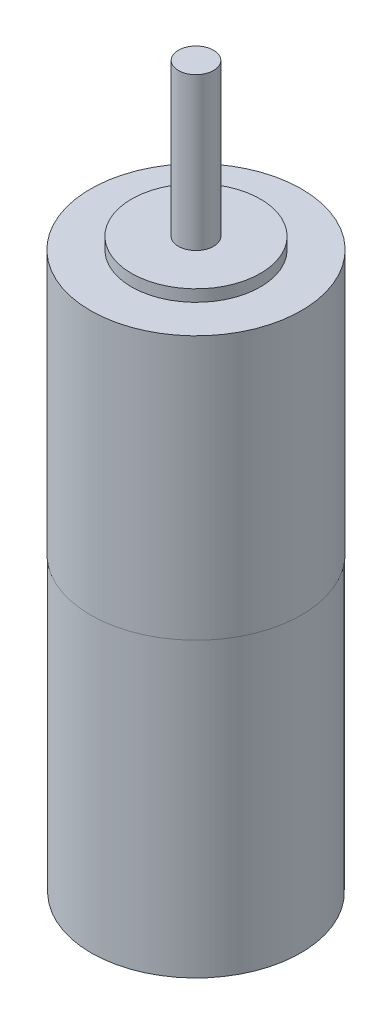
ISO-10303-21;
HEADER;
FILE_DESCRIPTION(('STEP AP214'),'2;1');
FILE_NAME('part.step','',(''),(''),'','','');
FILE_SCHEMA(('AUTOMOTIVE_DESIGN { 1 0 10303 214 1 1 1 1 }'));
ENDSEC;
DATA;
#1=APPLICATION_CONTEXT('core data for automotive mechanical design processes');
#2=APPLICATION_PROTOCOL_DEFINITION('international standard','automotive_design',2000,#1);
#3=PRODUCT_CONTEXT('',#1,'mechanical');
#4=PRODUCT('Part','Part','',(#3));
#5=PRODUCT_RELATED_PRODUCT_CATEGORY('part','',(#4));
#6=PRODUCT_DEFINITION_FORMATION('','',#4);
#7=PRODUCT_DEFINITION_CONTEXT('part definition',#1,'design');
#8=PRODUCT_DEFINITION('design','',#6,#7);
#9=PRODUCT_DEFINITION_SHAPE('','',#8);
#10=(LENGTH_UNIT() NAMED_UNIT(*) SI_UNIT(.MILLI.,.METRE.));
#11=(NAMED_UNIT(*) PLANE_ANGLE_UNIT() SI_UNIT($,.RADIAN.));
#12=(NAMED_UNIT(*) SI_UNIT($,.STERADIAN.) SOLID_ANGLE_UNIT());
#13=UNCERTAINTY_MEASURE_WITH_UNIT(LENGTH_MEASURE(1.E-05),#10,'distance_accuracy_value','');
#14=(GEOMETRIC_REPRESENTATION_CONTEXT(3) GLOBAL_UNCERTAINTY_ASSIGNED_CONTEXT((#13)) GLOBAL_UNIT_ASSIGNED_CONTEXT((#10,
#11,#12)) REPRESENTATION_CONTEXT('',''));
#15=CARTESIAN_POINT('',(0.,0.,0.));
#16=DIRECTION('',(0.,0.,1.));
#17=DIRECTION('',(1.,0.,0.));
#18=AXIS2_PLACEMENT_3D('',#15,#16,#17);
#19=CARTESIAN_POINT('',(0.,50.,0.));
#20=DIRECTION('',(0.,-1.,0.));
#21=DIRECTION('',(0.,0.,-1.));
#22=AXIS2_PLACEMENT_3D('',#19,#20,#21);
#23=CYLINDRICAL_SURFACE('',#22,17.9);
#24=CARTESIAN_POINT('',(0.,50.,0.));
#25=DIRECTION('',(0.,1.,0.));
#26=DIRECTION('',(0.,0.,1.));
#27=AXIS2_PLACEMENT_3D('',#24,#25,#26);
#28=CIRCLE('',#27,17.9);
#29=CARTESIAN_POINT('',(0.,50.,17.9));
#30=VERTEX_POINT('',#29);
#31=EDGE_CURVE('E51',#30,#30,#28,.T.);
#32=ORIENTED_EDGE('',*,*,#31,.F.);
#33=EDGE_LOOP('',(#32));
#34=FACE_BOUND('',#33,.T.);
#35=CARTESIAN_POINT('',(0.,0.,0.));
#36=DIRECTION('',(0.,1.,0.));
#37=DIRECTION('',(0.,0.,1.));
#38=AXIS2_PLACEMENT_3D('',#35,#36,#37);
#39=CIRCLE('',#38,17.9);
#40=CARTESIAN_POINT('',(0.,0.,17.9));
#41=VERTEX_POINT('',#40);
#42=EDGE_CURVE('E40',#41,#41,#39,.T.);
#43=ORIENTED_EDGE('',*,*,#42,.T.);
#44=EDGE_LOOP('',(#43));
#45=FACE_BOUND('',#44,.T.);
#46=ADVANCED_FACE('F37',(#34,#45),#23,.T.);
#47=CARTESIAN_POINT('',(0.,0.,0.));
#48=DIRECTION('',(0.,1.,0.));
#49=DIRECTION('',(0.,0.,1.));
#50=AXIS2_PLACEMENT_3D('',#47,#48,#49);
#51=PLANE('',#50);
#52=ORIENTED_EDGE('',*,*,#42,.F.);
#53=EDGE_LOOP('',(#52));
#54=FACE_BOUND('',#53,.T.);
#55=ADVANCED_FACE('F76',(#54),#51,.F.);
#56=CARTESIAN_POINT('',(0.,95.,0.));
#57=DIRECTION('',(0.,-1.,0.));
#58=DIRECTION('',(0.,0.,-1.));
#59=AXIS2_PLACEMENT_3D('',#56,#57,#58);
#60=CYLINDRICAL_SURFACE('',#59,18.);
#61=CARTESIAN_POINT('',(0.,95.,0.));
#62=DIRECTION('',(0.,1.,0.));
#63=DIRECTION('',(0.,0.,1.));
#64=AXIS2_PLACEMENT_3D('',#61,#62,#63);
#65=CIRCLE('',#64,18.);
#66=CARTESIAN_POINT('',(0.,95.,-18.));
#67=VERTEX_POINT('',#66);
#68=EDGE_CURVE('E61',#67,#67,#65,.T.);
#69=CARTESIAN_POINT('',(0.,50.,0.));
#70=DIRECTION('',(0.,1.,0.));
#71=DIRECTION('',(0.,0.,1.));
#72=AXIS2_PLACEMENT_3D('',#69,#70,#71);
#73=CIRCLE('',#72,18.);
#74=CARTESIAN_POINT('',(0.,50.,-18.));
#75=VERTEX_POINT('',#74);
#76=EDGE_CURVE('E59',#75,#75,#73,.T.);
#77=CARTESIAN_POINT('',(0.,95.,-18.));
#78=CARTESIAN_POINT('',(0.,94.53125,-18.));
#79=CARTESIAN_POINT('',(0.,94.0625,-18.));
#80=CARTESIAN_POINT('',(0.,93.125,-18.));
#81=CARTESIAN_POINT('',(0.,92.65625,-18.));
#82=CARTESIAN_POINT('',(0.,91.71875,-18.));
#83=CARTESIAN_POINT('',(0.,91.25,-18.));
#84=CARTESIAN_POINT('',(0.,90.3125,-18.));
#85=CARTESIAN_POINT('',(0.,89.84375,-18.));
#86=CARTESIAN_POINT('',(0.,88.90625,-18.));
#87=CARTESIAN_POINT('',(0.,88.4375,-18.));
#88=CARTESIAN_POINT('',(0.,87.5,-18.));
#89=CARTESIAN_POINT('',(0.,87.03125,-18.));
#90=CARTESIAN_POINT('',(0.,86.09375,-18.));
#91=CARTESIAN_POINT('',(0.,85.625,-18.));
#92=CARTESIAN_POINT('',(0.,84.6875,-18.));
#93=CARTESIAN_POINT('',(0.,84.21875,-18.));
#94=CARTESIAN_POINT('',(0.,83.28125,-18.));
#95=CARTESIAN_POINT('',(0.,82.8125,-18.));
#96=CARTESIAN_POINT('',(0.,81.875,-18.));
#97=CARTESIAN_POINT('',(0.,81.40625,-18.));
#98=CARTESIAN_POINT('',(0.,80.46875,-18.));
#99=CARTESIAN_POINT('',(0.,80.,-18.));
#100=CARTESIAN_POINT('',(0.,79.0625,-18.));
#101=CARTESIAN_POINT('',(0.,78.59375,-18.));
#102=CARTESIAN_POINT('',(0.,77.65625,-18.));
#103=CARTESIAN_POINT('',(0.,77.1875,-18.));
#104=CARTESIAN_POINT('',(0.,76.25,-18.));
#105=CARTESIAN_POINT('',(0.,75.78125,-18.));
#106=CARTESIAN_POINT('',(0.,74.84375,-18.));
#107=CARTESIAN_POINT('',(0.,74.375,-18.));
#108=CARTESIAN_POINT('',(0.,73.4375,-18.));
#109=CARTESIAN_POINT('',(0.,72.96875,-18.));
#110=CARTESIAN_POINT('',(0.,72.03125,-18.));
#111=CARTESIAN_POINT('',(0.,71.5625,-18.));
#112=CARTESIAN_POINT('',(0.,70.625,-18.));
#113=CARTESIAN_POINT('',(0.,70.15625,-18.));
#114=CARTESIAN_POINT('',(0.,69.21875,-18.));
#115=CARTESIAN_POINT('',(0.,68.75,-18.));
#116=CARTESIAN_POINT('',(0.,67.8125,-18.));
#117=CARTESIAN_POINT('',(0.,67.34375,-18.));
#118=CARTESIAN_POINT('',(0.,66.40625,-18.));
#119=CARTESIAN_POINT('',(0.,65.9375,-18.));
#120=CARTESIAN_POINT('',(0.,65.,-18.));
#121=CARTESIAN_POINT('',(0.,64.53125,-18.));
#122=CARTESIAN_POINT('',(0.,63.59375,-18.));
#123=CARTESIAN_POINT('',(0.,63.125,-18.));
#124=CARTESIAN_POINT('',(0.,62.1875,-18.));
#125=CARTESIAN_POINT('',(0.,61.71875,-18.));
#126=CARTESIAN_POINT('',(0.,60.78125,-18.));
#127=CARTESIAN_POINT('',(0.,60.3125,-18.));
#128=CARTESIAN_POINT('',(0.,59.375,-18.));
#129=CARTESIAN_POINT('',(0.,58.90625,-18.));
#130=CARTESIAN_POINT('',(0.,57.96875,-18.));
#131=CARTESIAN_POINT('',(0.,57.5,-18.));
#132=CARTESIAN_POINT('',(0.,56.5625,-18.));
#133=CARTESIAN_POINT('',(0.,56.09375,-18.));
#134=CARTESIAN_POINT('',(0.,55.15625,-18.));
#135=CARTESIAN_POINT('',(0.,54.6875,-18.));
#136=CARTESIAN_POINT('',(0.,53.75,-18.));
#137=CARTESIAN_POINT('',(0.,53.28125,-18.));
#138=CARTESIAN_POINT('',(0.,52.34375,-18.));
#139=CARTESIAN_POINT('',(0.,51.875,-18.));
#140=CARTESIAN_POINT('',(0.,50.9375,-18.));
#141=CARTESIAN_POINT('',(0.,50.46875,-18.));
#142=CARTESIAN_POINT('',(0.,50.,-18.));
#143=B_SPLINE_CURVE_WITH_KNOTS('',3,(#77,#78,#79,#80,#81,#82,#83,#84,#85,#86,#87,#88,#89,#90,
#91,#92,#93,#94,#95,#96,#97,#98,#99,#100,#101,#102,#103,#104,#105,#106,#107,#108,#109,#110,#111,
#112,#113,#114,#115,#116,#117,#118,#119,#120,#121,#122,#123,#124,#125,#126,#127,#128,#129,#130,
#131,#132,#133,#134,#135,#136,#137,#138,#139,#140,#141,#142),.UNSPECIFIED.,.F.,.F.,(4,2,2,2,2,2,
2,2,2,2,2,2,2,2,2,2,2,2,2,2,2,2,2,2,2,2,2,2,2,2,2,2,4),(0.,1.40625,2.8125,4.21874999999999,
5.62499999999999,7.03124999999999,8.43749999999999,9.84375,11.25,12.65625,14.0625,15.46875,
16.875,18.28125,19.6875,21.09375,22.5,23.90625,25.3125,26.71875,28.125,29.53125,30.9375,
32.34375,33.75,35.15625,36.5625,37.96875,39.375,40.78125,42.1875,43.59375,45.),.UNSPECIFIED.);
#144=EDGE_CURVE('BSEAM78',#67,#75,#143,.T.);
#145=ORIENTED_EDGE('',*,*,#68,.F.);
#146=ORIENTED_EDGE('',*,*,#76,.T.);
#147=ORIENTED_EDGE('',*,*,#144,.T.);
#148=ORIENTED_EDGE('',*,*,#144,.F.);
#149=EDGE_LOOP('',(#145,#147,#146,#148));
#150=FACE_BOUND('',#149,.T.);
#151=ADVANCED_FACE('F78',(#150),#60,.T.);
#152=CARTESIAN_POINT('',(0.,95.,0.));
#153=DIRECTION('',(0.,1.,0.));
#154=DIRECTION('',(0.,0.,1.));
#155=AXIS2_PLACEMENT_3D('',#152,#153,#154);
#156=PLANE('',#155);
#157=CARTESIAN_POINT('',(0.,95.,0.));
#158=DIRECTION('',(0.,1.,0.));
#159=DIRECTION('',(0.,0.,1.));
#160=AXIS2_PLACEMENT_3D('',#157,#158,#159);
#161=CIRCLE('',#160,11.);
#162=CARTESIAN_POINT('',(0.,95.,11.));
#163=VERTEX_POINT('',#162);
#164=EDGE_CURVE('E45',#163,#163,#161,.T.);
#165=ORIENTED_EDGE('',*,*,#164,.F.);
#166=EDGE_LOOP('',(#165));
#167=FACE_BOUND('',#166,.T.);
#168=ORIENTED_EDGE('',*,*,#68,.T.);
#169=EDGE_LOOP('',(#168));
#170=FACE_BOUND('',#169,.T.);
#171=ADVANCED_FACE('F83',(#167,#170),#156,.T.);
#172=CARTESIAN_POINT('',(0.,50.,0.));
#173=DIRECTION('',(0.,1.,0.));
#174=DIRECTION('',(0.,0.,1.));
#175=AXIS2_PLACEMENT_3D('',#172,#173,#174);
#176=PLANE('',#175);
#177=ORIENTED_EDGE('',*,*,#31,.T.);
#178=EDGE_LOOP('',(#177));
#179=FACE_BOUND('',#178,.T.);
#180=ORIENTED_EDGE('',*,*,#76,.F.);
#181=EDGE_LOOP('',(#180));
#182=FACE_BOUND('',#181,.T.);
#183=ADVANCED_FACE('F88',(#179,#182),#176,.F.);
#184=CARTESIAN_POINT('',(0.,97.,0.));
#185=DIRECTION('',(0.,-1.,0.));
#186=DIRECTION('',(0.,0.,-1.));
#187=AXIS2_PLACEMENT_3D('',#184,#185,#186);
#188=CYLINDRICAL_SURFACE('',#187,11.);
#189=CARTESIAN_POINT('',(0.,97.,0.));
#190=DIRECTION('',(0.,1.,0.));
#191=DIRECTION('',(0.,0.,1.));
#192=AXIS2_PLACEMENT_3D('',#189,#190,#191);
#193=CIRCLE('',#192,11.);
#194=CARTESIAN_POINT('',(0.,97.,11.));
#195=VERTEX_POINT('',#194);
#196=EDGE_CURVE('E56',#195,#195,#193,.T.);
#197=ORIENTED_EDGE('',*,*,#196,.F.);
#198=EDGE_LOOP('',(#197));
#199=FACE_BOUND('',#198,.T.);
#200=ORIENTED_EDGE('',*,*,#164,.T.);
#201=EDGE_LOOP('',(#200));
#202=FACE_BOUND('',#201,.T.);
#203=ADVANCED_FACE('F91',(#199,#202),#188,.T.);
#204=CARTESIAN_POINT('',(0.,97.,0.));
#205=DIRECTION('',(0.,1.,0.));
#206=DIRECTION('',(0.,0.,1.));
#207=AXIS2_PLACEMENT_3D('',#204,#205,#206);
#208=PLANE('',#207);
#209=CARTESIAN_POINT('',(0.,97.,0.));
#210=DIRECTION('',(0.,1.,0.));
#211=DIRECTION('',(0.,0.,1.));
#212=AXIS2_PLACEMENT_3D('',#209,#210,#211);
#213=CIRCLE('',#212,3.);
#214=CARTESIAN_POINT('',(0.,97.,-3.));
#215=VERTEX_POINT('',#214);
#216=EDGE_CURVE('E10',#215,#215,#213,.T.);
#217=ORIENTED_EDGE('',*,*,#216,.F.);
#218=EDGE_LOOP('',(#217));
#219=FACE_BOUND('',#218,.T.);
#220=ORIENTED_EDGE('',*,*,#196,.T.);
#221=EDGE_LOOP('',(#220));
#222=FACE_BOUND('',#221,.T.);
#223=ADVANCED_FACE('F97',(#219,#222),#208,.T.);
#224=CARTESIAN_POINT('',(0.,123.,0.));
#225=DIRECTION('',(0.,-1.,0.));
#226=DIRECTION('',(0.,0.,-1.));
#227=AXIS2_PLACEMENT_3D('',#224,#225,#226);
#228=CYLINDRICAL_SURFACE('',#227,3.);
#229=CARTESIAN_POINT('',(0.,123.,0.));
#230=DIRECTION('',(0.,1.,0.));
#231=DIRECTION('',(0.,0.,1.));
#232=AXIS2_PLACEMENT_3D('',#229,#230,#231);
#233=CIRCLE('',#232,3.);
#234=CARTESIAN_POINT('',(0.,123.,-3.));
#235=VERTEX_POINT('',#234);
#236=EDGE_CURVE('E55',#235,#235,#233,.T.);
#237=CARTESIAN_POINT('',(0.,123.,-3.));
#238=CARTESIAN_POINT('',(0.,122.729166666667,-3.));
#239=CARTESIAN_POINT('',(0.,122.458333333333,-3.));
#240=CARTESIAN_POINT('',(0.,121.916666666667,-3.));
#241=CARTESIAN_POINT('',(0.,121.645833333333,-3.));
#242=CARTESIAN_POINT('',(0.,121.104166666667,-3.));
#243=CARTESIAN_POINT('',(0.,120.833333333333,-3.));
#244=CARTESIAN_POINT('',(0.,120.291666666667,-3.));
#245=CARTESIAN_POINT('',(0.,120.020833333333,-3.));
#246=CARTESIAN_POINT('',(0.,119.479166666667,-3.));
#247=CARTESIAN_POINT('',(0.,119.208333333333,-3.));
#248=CARTESIAN_POINT('',(0.,118.666666666667,-3.));
#249=CARTESIAN_POINT('',(0.,118.395833333333,-3.));
#250=CARTESIAN_POINT('',(0.,117.854166666667,-3.));
#251=CARTESIAN_POINT('',(0.,117.583333333333,-3.));
#252=CARTESIAN_POINT('',(0.,117.041666666667,-3.));
#253=CARTESIAN_POINT('',(0.,116.770833333333,-3.));
#254=CARTESIAN_POINT('',(0.,116.229166666667,-3.));
#255=CARTESIAN_POINT('',(0.,115.958333333333,-3.));
#256=CARTESIAN_POINT('',(0.,115.416666666667,-3.));
#257=CARTESIAN_POINT('',(0.,115.145833333333,-3.));
#258=CARTESIAN_POINT('',(0.,114.604166666667,-3.));
#259=CARTESIAN_POINT('',(0.,114.333333333333,-3.));
#260=CARTESIAN_POINT('',(0.,113.791666666667,-3.));
#261=CARTESIAN_POINT('',(0.,113.520833333333,-3.));
#262=CARTESIAN_POINT('',(0.,112.979166666667,-3.));
#263=CARTESIAN_POINT('',(0.,112.708333333333,-3.));
#264=CARTESIAN_POINT('',(0.,112.166666666667,-3.));
#265=CARTESIAN_POINT('',(0.,111.895833333333,-3.));
#266=CARTESIAN_POINT('',(0.,111.354166666667,-3.));
#267=CARTESIAN_POINT('',(0.,111.083333333333,-3.));
#268=CARTESIAN_POINT('',(0.,110.541666666667,-3.));
#269=CARTESIAN_POINT('',(0.,110.270833333333,-3.));
#270=CARTESIAN_POINT('',(0.,109.729166666667,-3.));
#271=CARTESIAN_POINT('',(0.,109.458333333333,-3.));
#272=CARTESIAN_POINT('',(0.,108.916666666667,-3.));
#273=CARTESIAN_POINT('',(0.,108.645833333333,-3.));
#274=CARTESIAN_POINT('',(0.,108.104166666667,-3.));
#275=CARTESIAN_POINT('',(0.,107.833333333333,-3.));
#276=CARTESIAN_POINT('',(0.,107.291666666667,-3.));
#277=CARTESIAN_POINT('',(0.,107.020833333333,-3.));
#278=CARTESIAN_POINT('',(0.,106.479166666667,-3.));
#279=CARTESIAN_POINT('',(0.,106.208333333333,-3.));
#280=CARTESIAN_POINT('',(0.,105.666666666667,-3.));
#281=CARTESIAN_POINT('',(0.,105.395833333333,-3.));
#282=CARTESIAN_POINT('',(0.,104.854166666667,-3.));
#283=CARTESIAN_POINT('',(0.,104.583333333333,-3.));
#284=CARTESIAN_POINT('',(0.,104.041666666667,-3.));
#285=CARTESIAN_POINT('',(0.,103.770833333333,-3.));
#286=CARTESIAN_POINT('',(0.,103.229166666667,-3.));
#287=CARTESIAN_POINT('',(0.,102.958333333333,-3.));
#288=CARTESIAN_POINT('',(0.,102.416666666667,-3.));
#289=CARTESIAN_POINT('',(0.,102.145833333333,-3.));
#290=CARTESIAN_POINT('',(0.,101.604166666667,-3.));
#291=CARTESIAN_POINT('',(0.,101.333333333333,-3.));
#292=CARTESIAN_POINT('',(0.,100.791666666667,-3.));
#293=CARTESIAN_POINT('',(0.,100.520833333333,-3.));
#294=CARTESIAN_POINT('',(0.,99.9791666666667,-3.));
#295=CARTESIAN_POINT('',(0.,99.7083333333333,-3.));
#296=CARTESIAN_POINT('',(0.,99.1666666666667,-3.));
#297=CARTESIAN_POINT('',(0.,98.8958333333333,-3.));
#298=CARTESIAN_POINT('',(0.,98.3541666666667,-3.));
#299=CARTESIAN_POINT('',(0.,98.0833333333333,-3.));
#300=CARTESIAN_POINT('',(0.,97.5416666666667,-3.));
#301=CARTESIAN_POINT('',(0.,97.2708333333333,-3.));
#302=CARTESIAN_POINT('',(0.,97.,-3.));
#303=B_SPLINE_CURVE_WITH_KNOTS('',3,(#237,#238,#239,#240,#241,#242,#243,#244,#245,#246,#247,
#248,#249,#250,#251,#252,#253,#254,#255,#256,#257,#258,#259,#260,#261,#262,#263,#264,#265,#266,
#267,#268,#269,#270,#271,#272,#273,#274,#275,#276,#277,#278,#279,#280,#281,#282,#283,#284,#285,
#286,#287,#288,#289,#290,#291,#292,#293,#294,#295,#296,#297,#298,#299,#300,#301,#302),
.UNSPECIFIED.,.F.,.F.,(4,2,2,2,2,2,2,2,2,2,2,2,2,2,2,2,2,2,2,2,2,2,2,2,2,2,2,2,2,2,2,2,4),(0.,
0.812499999999994,1.62499999999999,2.4375,3.24999999999999,4.0625,4.87499999999999,5.6875,
6.49999999999999,7.31249999999999,8.12499999999999,8.93749999999999,9.74999999999999,10.5625,
11.375,12.1875,13.,13.8125,14.625,15.4375,16.25,17.0625,17.875,18.6875,19.5,20.3125,21.125,
21.9375,22.75,23.5625,24.375,25.1875,26.),.UNSPECIFIED.);
#304=EDGE_CURVE('BSEAM101',#235,#215,#303,.T.);
#305=ORIENTED_EDGE('',*,*,#236,.F.);
#306=ORIENTED_EDGE('',*,*,#216,.T.);
#307=ORIENTED_EDGE('',*,*,#304,.T.);
#308=ORIENTED_EDGE('',*,*,#304,.F.);
#309=EDGE_LOOP('',(#305,#307,#306,#308));
#310=FACE_BOUND('',#309,.T.);
#311=ADVANCED_FACE('F101',(#310),#228,.T.);
#312=CARTESIAN_POINT('',(0.,123.,0.));
#313=DIRECTION('',(0.,1.,0.));
#314=DIRECTION('',(0.,0.,1.));
#315=AXIS2_PLACEMENT_3D('',#312,#313,#314);
#316=PLANE('',#315);
#317=ORIENTED_EDGE('',*,*,#236,.T.);
#318=EDGE_LOOP('',(#317));
#319=FACE_BOUND('',#318,.T.);
#320=ADVANCED_FACE('F105',(#319),#316,.T.);
#321=CLOSED_SHELL('',(#46,#55,#151,#171,#183,#203,#223,#311,#320));
#322=MANIFOLD_SOLID_BREP('B2',#321);
#323=ADVANCED_BREP_SHAPE_REPRESENTATION('',(#18,#322),#14);
#324=SHAPE_DEFINITION_REPRESENTATION(#9,#323);
ENDSEC;
END-ISO-10303-21;
